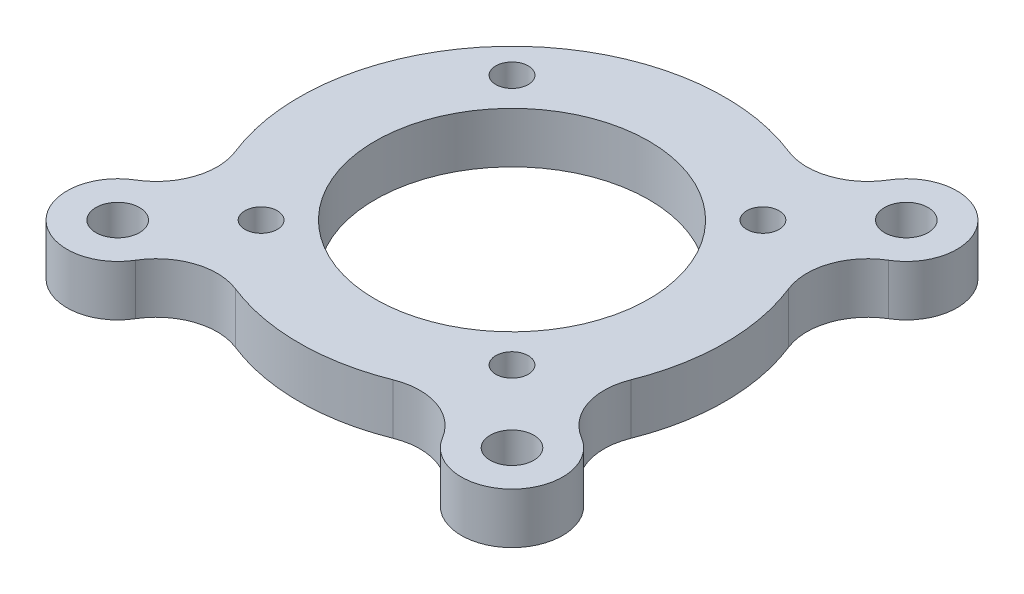
ISO-10303-21;
HEADER;
FILE_DESCRIPTION(('STEP AP214'),'2;1');
FILE_NAME('part.step','',(''),(''),'','','');
FILE_SCHEMA(('AUTOMOTIVE_DESIGN { 1 0 10303 214 1 1 1 1 }'));
ENDSEC;
DATA;
#1=APPLICATION_CONTEXT('core data for automotive mechanical design processes');
#2=APPLICATION_PROTOCOL_DEFINITION('international standard','automotive_design',2000,#1);
#3=PRODUCT_CONTEXT('',#1,'mechanical');
#4=PRODUCT('Part','Part','',(#3));
#5=PRODUCT_RELATED_PRODUCT_CATEGORY('part','',(#4));
#6=PRODUCT_DEFINITION_FORMATION('','',#4);
#7=PRODUCT_DEFINITION_CONTEXT('part definition',#1,'design');
#8=PRODUCT_DEFINITION('design','',#6,#7);
#9=PRODUCT_DEFINITION_SHAPE('','',#8);
#10=(LENGTH_UNIT() NAMED_UNIT(*) SI_UNIT(.MILLI.,.METRE.));
#11=(NAMED_UNIT(*) PLANE_ANGLE_UNIT() SI_UNIT($,.RADIAN.));
#12=(NAMED_UNIT(*) SI_UNIT($,.STERADIAN.) SOLID_ANGLE_UNIT());
#13=UNCERTAINTY_MEASURE_WITH_UNIT(LENGTH_MEASURE(1.E-05),#10,'distance_accuracy_value','');
#14=(GEOMETRIC_REPRESENTATION_CONTEXT(3) GLOBAL_UNCERTAINTY_ASSIGNED_CONTEXT((#13)) GLOBAL_UNIT_ASSIGNED_CONTEXT((#10,
#11,#12)) REPRESENTATION_CONTEXT('',''));
#15=CARTESIAN_POINT('',(0.,0.,0.));
#16=DIRECTION('',(0.,0.,1.));
#17=DIRECTION('',(1.,0.,0.));
#18=AXIS2_PLACEMENT_3D('',#15,#16,#17);
#19=CARTESIAN_POINT('',(9.99842374621287,5.,-25.0805008441053));
#20=DIRECTION('',(0.,-1.,0.));
#21=DIRECTION('',(0.,0.,-1.));
#22=AXIS2_PLACEMENT_3D('',#19,#20,#21);
#23=CYLINDRICAL_SURFACE('',#22,6.);
#24=CARTESIAN_POINT('',(9.99842374621287,0.,-25.0805008441053));
#25=DIRECTION('',(0.,1.,0.));
#26=DIRECTION('',(0.,0.,1.));
#27=AXIS2_PLACEMENT_3D('',#24,#25,#26);
#28=CIRCLE('',#27,6.);
#29=CARTESIAN_POINT('',(15.1513397842587,0.,-22.0068293742097));
#30=VERTEX_POINT('',#29);
#31=CARTESIAN_POINT('',(7.77655180261001,0.,-19.5070562120819));
#32=VERTEX_POINT('',#31);
#33=EDGE_CURVE('E178',#30,#32,#28,.F.);
#34=ORIENTED_EDGE('',*,*,#33,.T.);
#35=DIRECTION('',(0.,-1.,0.));
#36=VECTOR('',#35,1.);
#37=CARTESIAN_POINT('',(7.77655180261001,5.,-19.5070562120819));
#38=LINE('',#37,#36);
#39=CARTESIAN_POINT('',(7.77655180261001,5.,-19.5070562120819));
#40=VERTEX_POINT('',#39);
#41=EDGE_CURVE('E11',#40,#32,#38,.T.);
#42=ORIENTED_EDGE('',*,*,#41,.F.);
#43=CARTESIAN_POINT('',(9.99842374621287,5.,-25.0805008441053));
#44=DIRECTION('',(0.,1.,0.));
#45=DIRECTION('',(0.,0.,1.));
#46=AXIS2_PLACEMENT_3D('',#43,#44,#45);
#47=CIRCLE('',#46,6.);
#48=CARTESIAN_POINT('',(15.1513397842587,5.,-22.0068293742097));
#49=VERTEX_POINT('',#48);
#50=EDGE_CURVE('E269',#49,#40,#47,.F.);
#51=ORIENTED_EDGE('',*,*,#50,.F.);
#52=DIRECTION('',(0.,-1.,0.));
#53=VECTOR('',#52,1.);
#54=CARTESIAN_POINT('',(15.1513397842587,5.,-22.0068293742097));
#55=LINE('',#54,#53);
#56=EDGE_CURVE('E150',#49,#30,#55,.T.);
#57=ORIENTED_EDGE('',*,*,#56,.T.);
#58=EDGE_LOOP('',(#34,#42,#51,#57));
#59=FACE_BOUND('',#58,.T.);
#60=ADVANCED_FACE('F34',(#59),#23,.F.);
#61=CARTESIAN_POINT('',(0.,5.,0.));
#62=DIRECTION('',(0.,-1.,0.));
#63=DIRECTION('',(0.,0.,-1.));
#64=AXIS2_PLACEMENT_3D('',#61,#62,#63);
#65=CYLINDRICAL_SURFACE('',#64,21.);
#66=CARTESIAN_POINT('',(0.,0.,0.));
#67=DIRECTION('',(0.,1.,0.));
#68=DIRECTION('',(0.,0.,1.));
#69=AXIS2_PLACEMENT_3D('',#66,#67,#68);
#70=CIRCLE('',#69,21.);
#71=CARTESIAN_POINT('',(-19.507056212082,0.,7.77655180260978));
#72=VERTEX_POINT('',#71);
#73=EDGE_CURVE('E181',#32,#72,#70,.T.);
#74=ORIENTED_EDGE('',*,*,#73,.T.);
#75=DIRECTION('',(0.,-1.,0.));
#76=VECTOR('',#75,1.);
#77=CARTESIAN_POINT('',(-19.507056212082,5.,7.77655180260978));
#78=LINE('',#77,#76);
#79=CARTESIAN_POINT('',(-19.507056212082,5.,7.77655180260978));
#80=VERTEX_POINT('',#79);
#81=EDGE_CURVE('E43',#80,#72,#78,.T.);
#82=ORIENTED_EDGE('',*,*,#81,.F.);
#83=CARTESIAN_POINT('',(0.,5.,0.));
#84=DIRECTION('',(0.,1.,0.));
#85=DIRECTION('',(0.,0.,1.));
#86=AXIS2_PLACEMENT_3D('',#83,#84,#85);
#87=CIRCLE('',#86,21.);
#88=EDGE_CURVE('E102',#40,#80,#87,.T.);
#89=ORIENTED_EDGE('',*,*,#88,.F.);
#90=ORIENTED_EDGE('',*,*,#41,.T.);
#91=EDGE_LOOP('',(#74,#82,#89,#90));
#92=FACE_BOUND('',#91,.T.);
#93=ADVANCED_FACE('F229',(#92),#65,.T.);
#94=CARTESIAN_POINT('',(-25.0805008441054,5.,9.99842374621258));
#95=DIRECTION('',(0.,-1.,0.));
#96=DIRECTION('',(0.,0.,-1.));
#97=AXIS2_PLACEMENT_3D('',#94,#95,#96);
#98=CYLINDRICAL_SURFACE('',#97,6.);
#99=CARTESIAN_POINT('',(-25.0805008441054,0.,9.99842374621258));
#100=DIRECTION('',(0.,1.,0.));
#101=DIRECTION('',(0.,0.,1.));
#102=AXIS2_PLACEMENT_3D('',#99,#100,#101);
#103=CIRCLE('',#102,6.);
#104=CARTESIAN_POINT('',(-22.0068293742098,0.,15.1513397842584));
#105=VERTEX_POINT('',#104);
#106=EDGE_CURVE('E184',#105,#72,#103,.T.);
#107=ORIENTED_EDGE('',*,*,#106,.F.);
#108=DIRECTION('',(0.,-1.,0.));
#109=VECTOR('',#108,1.);
#110=CARTESIAN_POINT('',(-22.0068293742098,5.,15.1513397842584));
#111=LINE('',#110,#109);
#112=CARTESIAN_POINT('',(-22.0068293742098,5.,15.1513397842584));
#113=VERTEX_POINT('',#112);
#114=EDGE_CURVE('E222',#113,#105,#111,.T.);
#115=ORIENTED_EDGE('',*,*,#114,.F.);
#116=CARTESIAN_POINT('',(-25.0805008441054,5.,9.99842374621258));
#117=DIRECTION('',(0.,1.,0.));
#118=DIRECTION('',(0.,0.,1.));
#119=AXIS2_PLACEMENT_3D('',#116,#117,#118);
#120=CIRCLE('',#119,6.);
#121=EDGE_CURVE('E228',#113,#80,#120,.T.);
#122=ORIENTED_EDGE('',*,*,#121,.T.);
#123=ORIENTED_EDGE('',*,*,#81,.T.);
#124=EDGE_LOOP('',(#107,#115,#122,#123));
#125=FACE_BOUND('',#124,.T.);
#126=ADVANCED_FACE('F226',(#125),#98,.F.);
#127=CARTESIAN_POINT('',(-19.4454364826302,5.,19.4454364826299));
#128=DIRECTION('',(0.,-1.,0.));
#129=DIRECTION('',(0.,0.,-1.));
#130=AXIS2_PLACEMENT_3D('',#127,#128,#129);
#131=CYLINDRICAL_SURFACE('',#130,5.);
#132=CARTESIAN_POINT('',(-19.4454364826302,0.,19.4454364826299));
#133=DIRECTION('',(0.,1.,0.));
#134=DIRECTION('',(0.,0.,1.));
#135=AXIS2_PLACEMENT_3D('',#132,#133,#134);
#136=CIRCLE('',#135,5.);
#137=CARTESIAN_POINT('',(-15.1513397842587,0.,22.0068293742096));
#138=VERTEX_POINT('',#137);
#139=EDGE_CURVE('E187',#105,#138,#136,.T.);
#140=ORIENTED_EDGE('',*,*,#139,.T.);
#141=DIRECTION('',(0.,-1.,0.));
#142=VECTOR('',#141,1.);
#143=CARTESIAN_POINT('',(-15.1513397842587,5.,22.0068293742096));
#144=LINE('',#143,#142);
#145=CARTESIAN_POINT('',(-15.1513397842587,5.,22.0068293742096));
#146=VERTEX_POINT('',#145);
#147=EDGE_CURVE('E219',#146,#138,#144,.T.);
#148=ORIENTED_EDGE('',*,*,#147,.F.);
#149=CARTESIAN_POINT('',(-19.4454364826302,5.,19.4454364826299));
#150=DIRECTION('',(0.,1.,0.));
#151=DIRECTION('',(0.,0.,1.));
#152=AXIS2_PLACEMENT_3D('',#149,#150,#151);
#153=CIRCLE('',#152,5.);
#154=EDGE_CURVE('E248',#113,#146,#153,.T.);
#155=ORIENTED_EDGE('',*,*,#154,.F.);
#156=ORIENTED_EDGE('',*,*,#114,.T.);
#157=EDGE_LOOP('',(#140,#148,#155,#156));
#158=FACE_BOUND('',#157,.T.);
#159=ADVANCED_FACE('F239',(#158),#131,.T.);
#160=CARTESIAN_POINT('',(-9.99842374621291,5.,25.0805008441053));
#161=DIRECTION('',(0.,-1.,0.));
#162=DIRECTION('',(0.,0.,-1.));
#163=AXIS2_PLACEMENT_3D('',#160,#161,#162);
#164=CYLINDRICAL_SURFACE('',#163,6.);
#165=CARTESIAN_POINT('',(-9.99842374621291,0.,25.0805008441053));
#166=DIRECTION('',(0.,1.,0.));
#167=DIRECTION('',(0.,0.,1.));
#168=AXIS2_PLACEMENT_3D('',#165,#166,#167);
#169=CIRCLE('',#168,6.);
#170=CARTESIAN_POINT('',(-7.77655180261004,0.,19.5070562120819));
#171=VERTEX_POINT('',#170);
#172=EDGE_CURVE('E189',#138,#171,#169,.F.);
#173=ORIENTED_EDGE('',*,*,#172,.T.);
#174=DIRECTION('',(0.,-1.,0.));
#175=VECTOR('',#174,1.);
#176=CARTESIAN_POINT('',(-7.77655180261004,5.,19.5070562120819));
#177=LINE('',#176,#175);
#178=CARTESIAN_POINT('',(-7.77655180261004,5.,19.5070562120819));
#179=VERTEX_POINT('',#178);
#180=EDGE_CURVE('E216',#179,#171,#177,.T.);
#181=ORIENTED_EDGE('',*,*,#180,.F.);
#182=CARTESIAN_POINT('',(-9.99842374621291,5.,25.0805008441053));
#183=DIRECTION('',(0.,1.,0.));
#184=DIRECTION('',(0.,0.,1.));
#185=AXIS2_PLACEMENT_3D('',#182,#183,#184);
#186=CIRCLE('',#185,6.);
#187=EDGE_CURVE('E245',#146,#179,#186,.F.);
#188=ORIENTED_EDGE('',*,*,#187,.F.);
#189=ORIENTED_EDGE('',*,*,#147,.T.);
#190=EDGE_LOOP('',(#173,#181,#188,#189));
#191=FACE_BOUND('',#190,.T.);
#192=ADVANCED_FACE('F243',(#191),#164,.F.);
#193=CARTESIAN_POINT('',(0.,5.,0.));
#194=DIRECTION('',(0.,-1.,0.));
#195=DIRECTION('',(0.,0.,-1.));
#196=AXIS2_PLACEMENT_3D('',#193,#194,#195);
#197=CYLINDRICAL_SURFACE('',#196,21.);
#198=CARTESIAN_POINT('',(0.,0.,0.));
#199=DIRECTION('',(0.,1.,0.));
#200=DIRECTION('',(0.,0.,1.));
#201=AXIS2_PLACEMENT_3D('',#198,#199,#200);
#202=CIRCLE('',#201,21.);
#203=CARTESIAN_POINT('',(7.77655180260979,0.,19.507056212082));
#204=VERTEX_POINT('',#203);
#205=EDGE_CURVE('E191',#171,#204,#202,.T.);
#206=ORIENTED_EDGE('',*,*,#205,.T.);
#207=DIRECTION('',(0.,-1.,0.));
#208=VECTOR('',#207,1.);
#209=CARTESIAN_POINT('',(7.77655180260979,5.,19.507056212082));
#210=LINE('',#209,#208);
#211=CARTESIAN_POINT('',(7.77655180260979,5.,19.507056212082));
#212=VERTEX_POINT('',#211);
#213=EDGE_CURVE('E214',#212,#204,#210,.T.);
#214=ORIENTED_EDGE('',*,*,#213,.F.);
#215=CARTESIAN_POINT('',(0.,5.,0.));
#216=DIRECTION('',(0.,1.,0.));
#217=DIRECTION('',(0.,0.,1.));
#218=AXIS2_PLACEMENT_3D('',#215,#216,#217);
#219=CIRCLE('',#218,21.);
#220=EDGE_CURVE('E247',#179,#212,#219,.T.);
#221=ORIENTED_EDGE('',*,*,#220,.F.);
#222=ORIENTED_EDGE('',*,*,#180,.T.);
#223=EDGE_LOOP('',(#206,#214,#221,#222));
#224=FACE_BOUND('',#223,.T.);
#225=ADVANCED_FACE('F445',(#224),#197,.T.);
#226=CARTESIAN_POINT('',(9.99842374621259,5.,25.0805008441054));
#227=DIRECTION('',(0.,-1.,0.));
#228=DIRECTION('',(0.,0.,-1.));
#229=AXIS2_PLACEMENT_3D('',#226,#227,#228);
#230=CYLINDRICAL_SURFACE('',#229,6.);
#231=CARTESIAN_POINT('',(9.99842374621259,0.,25.0805008441054));
#232=DIRECTION('',(0.,1.,0.));
#233=DIRECTION('',(0.,0.,1.));
#234=AXIS2_PLACEMENT_3D('',#231,#232,#233);
#235=CIRCLE('',#234,6.);
#236=CARTESIAN_POINT('',(15.1513397842584,0.,22.0068293742098));
#237=VERTEX_POINT('',#236);
#238=EDGE_CURVE('E194',#237,#204,#235,.T.);
#239=ORIENTED_EDGE('',*,*,#238,.F.);
#240=DIRECTION('',(0.,-1.,0.));
#241=VECTOR('',#240,1.);
#242=CARTESIAN_POINT('',(15.1513397842584,5.,22.0068293742098));
#243=LINE('',#242,#241);
#244=CARTESIAN_POINT('',(15.1513397842584,5.,22.0068293742098));
#245=VERTEX_POINT('',#244);
#246=EDGE_CURVE('E212',#245,#237,#243,.T.);
#247=ORIENTED_EDGE('',*,*,#246,.F.);
#248=CARTESIAN_POINT('',(9.99842374621259,5.,25.0805008441054));
#249=DIRECTION('',(0.,1.,0.));
#250=DIRECTION('',(0.,0.,1.));
#251=AXIS2_PLACEMENT_3D('',#248,#249,#250);
#252=CIRCLE('',#251,6.);
#253=EDGE_CURVE('E250',#245,#212,#252,.T.);
#254=ORIENTED_EDGE('',*,*,#253,.T.);
#255=ORIENTED_EDGE('',*,*,#213,.T.);
#256=EDGE_LOOP('',(#239,#247,#254,#255));
#257=FACE_BOUND('',#256,.T.);
#258=ADVANCED_FACE('F436',(#257),#230,.F.);
#259=CARTESIAN_POINT('',(19.4454364826299,5.,19.4454364826302));
#260=DIRECTION('',(0.,-1.,0.));
#261=DIRECTION('',(0.,0.,-1.));
#262=AXIS2_PLACEMENT_3D('',#259,#260,#261);
#263=CYLINDRICAL_SURFACE('',#262,5.);
#264=CARTESIAN_POINT('',(19.4454364826299,0.,19.4454364826302));
#265=DIRECTION('',(0.,1.,0.));
#266=DIRECTION('',(0.,0.,1.));
#267=AXIS2_PLACEMENT_3D('',#264,#265,#266);
#268=CIRCLE('',#267,5.);
#269=CARTESIAN_POINT('',(22.0068293742096,0.,15.1513397842587));
#270=VERTEX_POINT('',#269);
#271=EDGE_CURVE('E197',#237,#270,#268,.T.);
#272=ORIENTED_EDGE('',*,*,#271,.T.);
#273=DIRECTION('',(0.,-1.,0.));
#274=VECTOR('',#273,1.);
#275=CARTESIAN_POINT('',(22.0068293742096,5.,15.1513397842587));
#276=LINE('',#275,#274);
#277=CARTESIAN_POINT('',(22.0068293742096,5.,15.1513397842587));
#278=VERTEX_POINT('',#277);
#279=EDGE_CURVE('E209',#278,#270,#276,.T.);
#280=ORIENTED_EDGE('',*,*,#279,.F.);
#281=CARTESIAN_POINT('',(19.4454364826299,5.,19.4454364826302));
#282=DIRECTION('',(0.,1.,0.));
#283=DIRECTION('',(0.,0.,1.));
#284=AXIS2_PLACEMENT_3D('',#281,#282,#283);
#285=CIRCLE('',#284,5.);
#286=EDGE_CURVE('E257',#245,#278,#285,.T.);
#287=ORIENTED_EDGE('',*,*,#286,.F.);
#288=ORIENTED_EDGE('',*,*,#246,.T.);
#289=EDGE_LOOP('',(#272,#280,#287,#288));
#290=FACE_BOUND('',#289,.T.);
#291=ADVANCED_FACE('F262',(#290),#263,.T.);
#292=CARTESIAN_POINT('',(25.0805008441053,5.,9.99842374621289));
#293=DIRECTION('',(0.,-1.,0.));
#294=DIRECTION('',(0.,0.,-1.));
#295=AXIS2_PLACEMENT_3D('',#292,#293,#294);
#296=CYLINDRICAL_SURFACE('',#295,6.);
#297=CARTESIAN_POINT('',(25.0805008441053,0.,9.99842374621289));
#298=DIRECTION('',(0.,1.,0.));
#299=DIRECTION('',(0.,0.,1.));
#300=AXIS2_PLACEMENT_3D('',#297,#298,#299);
#301=CIRCLE('',#300,6.);
#302=CARTESIAN_POINT('',(19.5070562120819,0.,7.77655180261002));
#303=VERTEX_POINT('',#302);
#304=EDGE_CURVE('E199',#270,#303,#301,.F.);
#305=ORIENTED_EDGE('',*,*,#304,.T.);
#306=DIRECTION('',(0.,-1.,0.));
#307=VECTOR('',#306,1.);
#308=CARTESIAN_POINT('',(19.5070562120819,5.,7.77655180261002));
#309=LINE('',#308,#307);
#310=CARTESIAN_POINT('',(19.5070562120819,5.,7.77655180261002));
#311=VERTEX_POINT('',#310);
#312=EDGE_CURVE('E146',#311,#303,#309,.T.);
#313=ORIENTED_EDGE('',*,*,#312,.F.);
#314=CARTESIAN_POINT('',(25.0805008441053,5.,9.99842374621289));
#315=DIRECTION('',(0.,1.,0.));
#316=DIRECTION('',(0.,0.,1.));
#317=AXIS2_PLACEMENT_3D('',#314,#315,#316);
#318=CIRCLE('',#317,6.);
#319=EDGE_CURVE('E133',#278,#311,#318,.F.);
#320=ORIENTED_EDGE('',*,*,#319,.F.);
#321=ORIENTED_EDGE('',*,*,#279,.T.);
#322=EDGE_LOOP('',(#305,#313,#320,#321));
#323=FACE_BOUND('',#322,.T.);
#324=ADVANCED_FACE('F266',(#323),#296,.F.);
#325=CARTESIAN_POINT('',(0.,5.,0.));
#326=DIRECTION('',(0.,-1.,0.));
#327=DIRECTION('',(0.,0.,-1.));
#328=AXIS2_PLACEMENT_3D('',#325,#326,#327);
#329=CYLINDRICAL_SURFACE('',#328,21.);
#330=CARTESIAN_POINT('',(0.,0.,0.));
#331=DIRECTION('',(0.,1.,0.));
#332=DIRECTION('',(0.,0.,1.));
#333=AXIS2_PLACEMENT_3D('',#330,#331,#332);
#334=CIRCLE('',#333,21.);
#335=CARTESIAN_POINT('',(19.507056212082,0.,-7.7765518026098));
#336=VERTEX_POINT('',#335);
#337=EDGE_CURVE('E142',#303,#336,#334,.T.);
#338=ORIENTED_EDGE('',*,*,#337,.T.);
#339=DIRECTION('',(0.,-1.,0.));
#340=VECTOR('',#339,1.);
#341=CARTESIAN_POINT('',(19.507056212082,5.,-7.7765518026098));
#342=LINE('',#341,#340);
#343=CARTESIAN_POINT('',(19.507056212082,5.,-7.7765518026098));
#344=VERTEX_POINT('',#343);
#345=EDGE_CURVE('E139',#344,#336,#342,.T.);
#346=ORIENTED_EDGE('',*,*,#345,.F.);
#347=CARTESIAN_POINT('',(0.,5.,0.));
#348=DIRECTION('',(0.,1.,0.));
#349=DIRECTION('',(0.,0.,1.));
#350=AXIS2_PLACEMENT_3D('',#347,#348,#349);
#351=CIRCLE('',#350,21.);
#352=EDGE_CURVE('E127',#311,#344,#351,.T.);
#353=ORIENTED_EDGE('',*,*,#352,.F.);
#354=ORIENTED_EDGE('',*,*,#312,.T.);
#355=EDGE_LOOP('',(#338,#346,#353,#354));
#356=FACE_BOUND('',#355,.T.);
#357=ADVANCED_FACE('F140',(#356),#329,.T.);
#358=CARTESIAN_POINT('',(25.0805008441054,5.,-9.99842374621261));
#359=DIRECTION('',(0.,-1.,0.));
#360=DIRECTION('',(0.,0.,-1.));
#361=AXIS2_PLACEMENT_3D('',#358,#359,#360);
#362=CYLINDRICAL_SURFACE('',#361,6.);
#363=CARTESIAN_POINT('',(25.0805008441054,0.,-9.99842374621261));
#364=DIRECTION('',(0.,1.,0.));
#365=DIRECTION('',(0.,0.,1.));
#366=AXIS2_PLACEMENT_3D('',#363,#364,#365);
#367=CIRCLE('',#366,6.);
#368=CARTESIAN_POINT('',(22.0068293742098,0.,-15.1513397842584));
#369=VERTEX_POINT('',#368);
#370=EDGE_CURVE('E202',#369,#336,#367,.T.);
#371=ORIENTED_EDGE('',*,*,#370,.F.);
#372=DIRECTION('',(0.,-1.,0.));
#373=VECTOR('',#372,1.);
#374=CARTESIAN_POINT('',(22.0068293742098,5.,-15.1513397842584));
#375=LINE('',#374,#373);
#376=CARTESIAN_POINT('',(22.0068293742098,5.,-15.1513397842584));
#377=VERTEX_POINT('',#376);
#378=EDGE_CURVE('E91',#377,#369,#375,.T.);
#379=ORIENTED_EDGE('',*,*,#378,.F.);
#380=CARTESIAN_POINT('',(25.0805008441054,5.,-9.99842374621261));
#381=DIRECTION('',(0.,1.,0.));
#382=DIRECTION('',(0.,0.,1.));
#383=AXIS2_PLACEMENT_3D('',#380,#381,#382);
#384=CIRCLE('',#383,6.);
#385=EDGE_CURVE('E131',#377,#344,#384,.T.);
#386=ORIENTED_EDGE('',*,*,#385,.T.);
#387=ORIENTED_EDGE('',*,*,#345,.T.);
#388=EDGE_LOOP('',(#371,#379,#386,#387));
#389=FACE_BOUND('',#388,.T.);
#390=ADVANCED_FACE('F148',(#389),#362,.F.);
#391=CARTESIAN_POINT('',(-19.4454364826302,5.,19.4454364826299));
#392=DIRECTION('',(0.,-1.,0.));
#393=DIRECTION('',(0.,0.,-1.));
#394=AXIS2_PLACEMENT_3D('',#391,#392,#393);
#395=CYLINDRICAL_SURFACE('',#394,2.15);
#396=CARTESIAN_POINT('',(-19.4454364826302,5.,19.4454364826299));
#397=DIRECTION('',(0.,1.,0.));
#398=DIRECTION('',(0.,0.,1.));
#399=AXIS2_PLACEMENT_3D('',#396,#397,#398);
#400=CIRCLE('',#399,2.15);
#401=CARTESIAN_POINT('',(-19.4454364826302,5.,21.5954364826299));
#402=VERTEX_POINT('',#401);
#403=EDGE_CURVE('E532',#402,#402,#400,.T.);
#404=ORIENTED_EDGE('',*,*,#403,.T.);
#405=EDGE_LOOP('',(#404));
#406=FACE_BOUND('',#405,.T.);
#407=CARTESIAN_POINT('',(-19.4454364826302,0.,19.4454364826299));
#408=DIRECTION('',(0.,1.,0.));
#409=DIRECTION('',(0.,0.,1.));
#410=AXIS2_PLACEMENT_3D('',#407,#408,#409);
#411=CIRCLE('',#410,2.15);
#412=CARTESIAN_POINT('',(-19.4454364826302,0.,21.5954364826299));
#413=VERTEX_POINT('',#412);
#414=EDGE_CURVE('E175',#413,#413,#411,.T.);
#415=ORIENTED_EDGE('',*,*,#414,.F.);
#416=EDGE_LOOP('',(#415));
#417=FACE_BOUND('',#416,.T.);
#418=ADVANCED_FACE('F291',(#406,#417),#395,.F.);
#419=CARTESIAN_POINT('',(19.4454364826299,5.,19.4454364826302));
#420=DIRECTION('',(0.,-1.,0.));
#421=DIRECTION('',(0.,0.,-1.));
#422=AXIS2_PLACEMENT_3D('',#419,#420,#421);
#423=CYLINDRICAL_SURFACE('',#422,2.15);
#424=CARTESIAN_POINT('',(19.4454364826299,5.,19.4454364826302));
#425=DIRECTION('',(0.,1.,0.));
#426=DIRECTION('',(0.,0.,1.));
#427=AXIS2_PLACEMENT_3D('',#424,#425,#426);
#428=CIRCLE('',#427,2.15);
#429=CARTESIAN_POINT('',(19.4454364826299,5.,21.5954364826302));
#430=VERTEX_POINT('',#429);
#431=EDGE_CURVE('E529',#430,#430,#428,.T.);
#432=ORIENTED_EDGE('',*,*,#431,.T.);
#433=EDGE_LOOP('',(#432));
#434=FACE_BOUND('',#433,.T.);
#435=CARTESIAN_POINT('',(19.4454364826299,0.,19.4454364826302));
#436=DIRECTION('',(0.,1.,0.));
#437=DIRECTION('',(0.,0.,1.));
#438=AXIS2_PLACEMENT_3D('',#435,#436,#437);
#439=CIRCLE('',#438,2.15);
#440=CARTESIAN_POINT('',(19.4454364826299,0.,21.5954364826302));
#441=VERTEX_POINT('',#440);
#442=EDGE_CURVE('E172',#441,#441,#439,.T.);
#443=ORIENTED_EDGE('',*,*,#442,.F.);
#444=EDGE_LOOP('',(#443));
#445=FACE_BOUND('',#444,.T.);
#446=ADVANCED_FACE('F294',(#434,#445),#423,.F.);
#447=CARTESIAN_POINT('',(19.4454364826302,5.,-19.44543648263));
#448=DIRECTION('',(0.,-1.,0.));
#449=DIRECTION('',(0.,0.,-1.));
#450=AXIS2_PLACEMENT_3D('',#447,#448,#449);
#451=CYLINDRICAL_SURFACE('',#450,2.15);
#452=CARTESIAN_POINT('',(19.4454364826302,5.,-19.44543648263));
#453=DIRECTION('',(0.,1.,0.));
#454=DIRECTION('',(0.,0.,1.));
#455=AXIS2_PLACEMENT_3D('',#452,#453,#454);
#456=CIRCLE('',#455,2.15);
#457=CARTESIAN_POINT('',(19.4454364826302,5.,-17.29543648263));
#458=VERTEX_POINT('',#457);
#459=EDGE_CURVE('E526',#458,#458,#456,.T.);
#460=ORIENTED_EDGE('',*,*,#459,.T.);
#461=EDGE_LOOP('',(#460));
#462=FACE_BOUND('',#461,.T.);
#463=CARTESIAN_POINT('',(19.4454364826302,0.,-19.44543648263));
#464=DIRECTION('',(0.,1.,0.));
#465=DIRECTION('',(0.,0.,1.));
#466=AXIS2_PLACEMENT_3D('',#463,#464,#465);
#467=CIRCLE('',#466,2.15);
#468=CARTESIAN_POINT('',(19.4454364826302,0.,-17.29543648263));
#469=VERTEX_POINT('',#468);
#470=EDGE_CURVE('E169',#469,#469,#467,.T.);
#471=ORIENTED_EDGE('',*,*,#470,.F.);
#472=EDGE_LOOP('',(#471));
#473=FACE_BOUND('',#472,.T.);
#474=ADVANCED_FACE('F298',(#462,#473),#451,.F.);
#475=CARTESIAN_POINT('',(-12.3743686707646,5.,-12.3743686707646));
#476=DIRECTION('',(0.,-1.,0.));
#477=DIRECTION('',(0.,0.,-1.));
#478=AXIS2_PLACEMENT_3D('',#475,#476,#477);
#479=CYLINDRICAL_SURFACE('',#478,1.6);
#480=CARTESIAN_POINT('',(-12.3743686707646,5.,-12.3743686707646));
#481=DIRECTION('',(0.,1.,0.));
#482=DIRECTION('',(0.,0.,1.));
#483=AXIS2_PLACEMENT_3D('',#480,#481,#482);
#484=CIRCLE('',#483,1.6);
#485=CARTESIAN_POINT('',(-12.3743686707646,5.,-10.7743686707645));
#486=VERTEX_POINT('',#485);
#487=EDGE_CURVE('E523',#486,#486,#484,.T.);
#488=ORIENTED_EDGE('',*,*,#487,.T.);
#489=EDGE_LOOP('',(#488));
#490=FACE_BOUND('',#489,.T.);
#491=CARTESIAN_POINT('',(-12.3743686707646,0.,-12.3743686707646));
#492=DIRECTION('',(0.,1.,0.));
#493=DIRECTION('',(0.,0.,1.));
#494=AXIS2_PLACEMENT_3D('',#491,#492,#493);
#495=CIRCLE('',#494,1.6);
#496=CARTESIAN_POINT('',(-12.3743686707646,0.,-10.7743686707645));
#497=VERTEX_POINT('',#496);
#498=EDGE_CURVE('E166',#497,#497,#495,.T.);
#499=ORIENTED_EDGE('',*,*,#498,.F.);
#500=EDGE_LOOP('',(#499));
#501=FACE_BOUND('',#500,.T.);
#502=ADVANCED_FACE('F302',(#490,#501),#479,.F.);
#503=CARTESIAN_POINT('',(-12.3743686707646,5.,12.3743686707646));
#504=DIRECTION('',(0.,-1.,0.));
#505=DIRECTION('',(0.,0.,-1.));
#506=AXIS2_PLACEMENT_3D('',#503,#504,#505);
#507=CYLINDRICAL_SURFACE('',#506,1.6);
#508=CARTESIAN_POINT('',(-12.3743686707646,5.,12.3743686707646));
#509=DIRECTION('',(0.,1.,0.));
#510=DIRECTION('',(0.,0.,1.));
#511=AXIS2_PLACEMENT_3D('',#508,#509,#510);
#512=CIRCLE('',#511,1.6);
#513=CARTESIAN_POINT('',(-12.3743686707646,5.,13.9743686707646));
#514=VERTEX_POINT('',#513);
#515=EDGE_CURVE('E516',#514,#514,#512,.T.);
#516=ORIENTED_EDGE('',*,*,#515,.T.);
#517=EDGE_LOOP('',(#516));
#518=FACE_BOUND('',#517,.T.);
#519=CARTESIAN_POINT('',(-12.3743686707646,0.,12.3743686707646));
#520=DIRECTION('',(0.,1.,0.));
#521=DIRECTION('',(0.,0.,1.));
#522=AXIS2_PLACEMENT_3D('',#519,#520,#521);
#523=CIRCLE('',#522,1.6);
#524=CARTESIAN_POINT('',(-12.3743686707646,0.,13.9743686707646));
#525=VERTEX_POINT('',#524);
#526=EDGE_CURVE('E163',#525,#525,#523,.T.);
#527=ORIENTED_EDGE('',*,*,#526,.F.);
#528=EDGE_LOOP('',(#527));
#529=FACE_BOUND('',#528,.T.);
#530=ADVANCED_FACE('F306',(#518,#529),#507,.F.);
#531=CARTESIAN_POINT('',(12.3743686707646,5.,12.3743686707646));
#532=DIRECTION('',(0.,-1.,0.));
#533=DIRECTION('',(0.,0.,-1.));
#534=AXIS2_PLACEMENT_3D('',#531,#532,#533);
#535=CYLINDRICAL_SURFACE('',#534,1.6);
#536=CARTESIAN_POINT('',(12.3743686707646,5.,12.3743686707646));
#537=DIRECTION('',(0.,1.,0.));
#538=DIRECTION('',(0.,0.,1.));
#539=AXIS2_PLACEMENT_3D('',#536,#537,#538);
#540=CIRCLE('',#539,1.6);
#541=CARTESIAN_POINT('',(12.3743686707646,5.,13.9743686707646));
#542=VERTEX_POINT('',#541);
#543=EDGE_CURVE('E513',#542,#542,#540,.T.);
#544=ORIENTED_EDGE('',*,*,#543,.T.);
#545=EDGE_LOOP('',(#544));
#546=FACE_BOUND('',#545,.T.);
#547=CARTESIAN_POINT('',(12.3743686707646,0.,12.3743686707646));
#548=DIRECTION('',(0.,1.,0.));
#549=DIRECTION('',(0.,0.,1.));
#550=AXIS2_PLACEMENT_3D('',#547,#548,#549);
#551=CIRCLE('',#550,1.6);
#552=CARTESIAN_POINT('',(12.3743686707646,0.,13.9743686707646));
#553=VERTEX_POINT('',#552);
#554=EDGE_CURVE('E160',#553,#553,#551,.T.);
#555=ORIENTED_EDGE('',*,*,#554,.F.);
#556=EDGE_LOOP('',(#555));
#557=FACE_BOUND('',#556,.T.);
#558=ADVANCED_FACE('F310',(#546,#557),#535,.F.);
#559=CARTESIAN_POINT('',(12.3743686707646,5.,-12.3743686707646));
#560=DIRECTION('',(0.,-1.,0.));
#561=DIRECTION('',(0.,0.,-1.));
#562=AXIS2_PLACEMENT_3D('',#559,#560,#561);
#563=CYLINDRICAL_SURFACE('',#562,1.6);
#564=CARTESIAN_POINT('',(12.3743686707646,5.,-12.3743686707646));
#565=DIRECTION('',(0.,1.,0.));
#566=DIRECTION('',(0.,0.,1.));
#567=AXIS2_PLACEMENT_3D('',#564,#565,#566);
#568=CIRCLE('',#567,1.6);
#569=CARTESIAN_POINT('',(12.3743686707646,5.,-10.7743686707646));
#570=VERTEX_POINT('',#569);
#571=EDGE_CURVE('E321',#570,#570,#568,.T.);
#572=ORIENTED_EDGE('',*,*,#571,.T.);
#573=EDGE_LOOP('',(#572));
#574=FACE_BOUND('',#573,.T.);
#575=CARTESIAN_POINT('',(12.3743686707646,0.,-12.3743686707646));
#576=DIRECTION('',(0.,1.,0.));
#577=DIRECTION('',(0.,0.,1.));
#578=AXIS2_PLACEMENT_3D('',#575,#576,#577);
#579=CIRCLE('',#578,1.6);
#580=CARTESIAN_POINT('',(12.3743686707646,0.,-10.7743686707646));
#581=VERTEX_POINT('',#580);
#582=EDGE_CURVE('E157',#581,#581,#579,.T.);
#583=ORIENTED_EDGE('',*,*,#582,.F.);
#584=EDGE_LOOP('',(#583));
#585=FACE_BOUND('',#584,.T.);
#586=ADVANCED_FACE('F279',(#574,#585),#563,.F.);
#587=CARTESIAN_POINT('',(0.,5.,0.));
#588=DIRECTION('',(0.,-1.,0.));
#589=DIRECTION('',(0.,0.,-1.));
#590=AXIS2_PLACEMENT_3D('',#587,#588,#589);
#591=CYLINDRICAL_SURFACE('',#590,13.5);
#592=CARTESIAN_POINT('',(0.,5.,0.));
#593=DIRECTION('',(0.,1.,0.));
#594=DIRECTION('',(0.,0.,1.));
#595=AXIS2_PLACEMENT_3D('',#592,#593,#594);
#596=CIRCLE('',#595,13.5);
#597=CARTESIAN_POINT('',(0.,5.,13.5));
#598=VERTEX_POINT('',#597);
#599=EDGE_CURVE('E205',#598,#598,#596,.T.);
#600=ORIENTED_EDGE('',*,*,#599,.T.);
#601=EDGE_LOOP('',(#600));
#602=FACE_BOUND('',#601,.T.);
#603=CARTESIAN_POINT('',(0.,0.,0.));
#604=DIRECTION('',(0.,1.,0.));
#605=DIRECTION('',(0.,0.,1.));
#606=AXIS2_PLACEMENT_3D('',#603,#604,#605);
#607=CIRCLE('',#606,13.5);
#608=CARTESIAN_POINT('',(0.,0.,13.5));
#609=VERTEX_POINT('',#608);
#610=EDGE_CURVE('E154',#609,#609,#607,.T.);
#611=ORIENTED_EDGE('',*,*,#610,.F.);
#612=EDGE_LOOP('',(#611));
#613=FACE_BOUND('',#612,.T.);
#614=ADVANCED_FACE('F36',(#602,#613),#591,.F.);
#615=CARTESIAN_POINT('',(19.4454364826302,5.,-19.44543648263));
#616=DIRECTION('',(0.,-1.,0.));
#617=DIRECTION('',(0.,0.,-1.));
#618=AXIS2_PLACEMENT_3D('',#615,#616,#617);
#619=CYLINDRICAL_SURFACE('',#618,5.);
#620=CARTESIAN_POINT('',(19.4454364826302,0.,-19.44543648263));
#621=DIRECTION('',(0.,1.,0.));
#622=DIRECTION('',(0.,0.,1.));
#623=AXIS2_PLACEMENT_3D('',#620,#621,#622);
#624=CIRCLE('',#623,5.);
#625=EDGE_CURVE('E94',#369,#30,#624,.T.);
#626=ORIENTED_EDGE('',*,*,#625,.T.);
#627=ORIENTED_EDGE('',*,*,#56,.F.);
#628=CARTESIAN_POINT('',(19.4454364826302,5.,-19.44543648263));
#629=DIRECTION('',(0.,1.,0.));
#630=DIRECTION('',(0.,0.,1.));
#631=AXIS2_PLACEMENT_3D('',#628,#629,#630);
#632=CIRCLE('',#631,5.);
#633=EDGE_CURVE('E51',#377,#49,#632,.T.);
#634=ORIENTED_EDGE('',*,*,#633,.F.);
#635=ORIENTED_EDGE('',*,*,#378,.T.);
#636=EDGE_LOOP('',(#626,#627,#634,#635));
#637=FACE_BOUND('',#636,.T.);
#638=ADVANCED_FACE('F270',(#637),#619,.T.);
#639=CARTESIAN_POINT('',(0.,5.,0.));
#640=DIRECTION('',(0.,1.,0.));
#641=DIRECTION('',(0.,0.,1.));
#642=AXIS2_PLACEMENT_3D('',#639,#640,#641);
#643=PLANE('',#642);
#644=ORIENTED_EDGE('',*,*,#599,.F.);
#645=EDGE_LOOP('',(#644));
#646=FACE_BOUND('',#645,.T.);
#647=ORIENTED_EDGE('',*,*,#571,.F.);
#648=EDGE_LOOP('',(#647));
#649=FACE_BOUND('',#648,.T.);
#650=ORIENTED_EDGE('',*,*,#543,.F.);
#651=EDGE_LOOP('',(#650));
#652=FACE_BOUND('',#651,.T.);
#653=ORIENTED_EDGE('',*,*,#515,.F.);
#654=EDGE_LOOP('',(#653));
#655=FACE_BOUND('',#654,.T.);
#656=ORIENTED_EDGE('',*,*,#487,.F.);
#657=EDGE_LOOP('',(#656));
#658=FACE_BOUND('',#657,.T.);
#659=ORIENTED_EDGE('',*,*,#459,.F.);
#660=EDGE_LOOP('',(#659));
#661=FACE_BOUND('',#660,.T.);
#662=ORIENTED_EDGE('',*,*,#431,.F.);
#663=EDGE_LOOP('',(#662));
#664=FACE_BOUND('',#663,.T.);
#665=ORIENTED_EDGE('',*,*,#403,.F.);
#666=EDGE_LOOP('',(#665));
#667=FACE_BOUND('',#666,.T.);
#668=ORIENTED_EDGE('',*,*,#50,.T.);
#669=ORIENTED_EDGE('',*,*,#88,.T.);
#670=ORIENTED_EDGE('',*,*,#121,.F.);
#671=ORIENTED_EDGE('',*,*,#154,.T.);
#672=ORIENTED_EDGE('',*,*,#187,.T.);
#673=ORIENTED_EDGE('',*,*,#220,.T.);
#674=ORIENTED_EDGE('',*,*,#253,.F.);
#675=ORIENTED_EDGE('',*,*,#286,.T.);
#676=ORIENTED_EDGE('',*,*,#319,.T.);
#677=ORIENTED_EDGE('',*,*,#352,.T.);
#678=ORIENTED_EDGE('',*,*,#385,.F.);
#679=ORIENTED_EDGE('',*,*,#633,.T.);
#680=EDGE_LOOP('',(#668,#669,#670,#671,#672,#673,#674,#675,#676,#677,#678,#679));
#681=FACE_BOUND('',#680,.T.);
#682=ADVANCED_FACE('F129',(#646,#649,#652,#655,#658,#661,#664,#667,#681),#643,.T.);
#683=CARTESIAN_POINT('',(0.,0.,0.));
#684=DIRECTION('',(0.,1.,0.));
#685=DIRECTION('',(0.,0.,1.));
#686=AXIS2_PLACEMENT_3D('',#683,#684,#685);
#687=PLANE('',#686);
#688=ORIENTED_EDGE('',*,*,#610,.T.);
#689=EDGE_LOOP('',(#688));
#690=FACE_BOUND('',#689,.T.);
#691=ORIENTED_EDGE('',*,*,#582,.T.);
#692=EDGE_LOOP('',(#691));
#693=FACE_BOUND('',#692,.T.);
#694=ORIENTED_EDGE('',*,*,#554,.T.);
#695=EDGE_LOOP('',(#694));
#696=FACE_BOUND('',#695,.T.);
#697=ORIENTED_EDGE('',*,*,#526,.T.);
#698=EDGE_LOOP('',(#697));
#699=FACE_BOUND('',#698,.T.);
#700=ORIENTED_EDGE('',*,*,#498,.T.);
#701=EDGE_LOOP('',(#700));
#702=FACE_BOUND('',#701,.T.);
#703=ORIENTED_EDGE('',*,*,#470,.T.);
#704=EDGE_LOOP('',(#703));
#705=FACE_BOUND('',#704,.T.);
#706=ORIENTED_EDGE('',*,*,#442,.T.);
#707=EDGE_LOOP('',(#706));
#708=FACE_BOUND('',#707,.T.);
#709=ORIENTED_EDGE('',*,*,#414,.T.);
#710=EDGE_LOOP('',(#709));
#711=FACE_BOUND('',#710,.T.);
#712=ORIENTED_EDGE('',*,*,#33,.F.);
#713=ORIENTED_EDGE('',*,*,#625,.F.);
#714=ORIENTED_EDGE('',*,*,#370,.T.);
#715=ORIENTED_EDGE('',*,*,#337,.F.);
#716=ORIENTED_EDGE('',*,*,#304,.F.);
#717=ORIENTED_EDGE('',*,*,#271,.F.);
#718=ORIENTED_EDGE('',*,*,#238,.T.);
#719=ORIENTED_EDGE('',*,*,#205,.F.);
#720=ORIENTED_EDGE('',*,*,#172,.F.);
#721=ORIENTED_EDGE('',*,*,#139,.F.);
#722=ORIENTED_EDGE('',*,*,#106,.T.);
#723=ORIENTED_EDGE('',*,*,#73,.F.);
#724=EDGE_LOOP('',(#712,#713,#714,#715,#716,#717,#718,#719,#720,#721,#722,#723));
#725=FACE_BOUND('',#724,.T.);
#726=ADVANCED_FACE('F234',(#690,#693,#696,#699,#702,#705,#708,#711,#725),#687,.F.);
#727=CLOSED_SHELL('',(#60,#93,#126,#159,#192,#225,#258,#291,#324,#357,#390,#418,#446,#474,#502,
#530,#558,#586,#614,#638,#682,#726));
#728=MANIFOLD_SOLID_BREP('B2',#727);
#729=ADVANCED_BREP_SHAPE_REPRESENTATION('',(#18,#728),#14);
#730=SHAPE_DEFINITION_REPRESENTATION(#9,#729);
ENDSEC;
END-ISO-10303-21;
